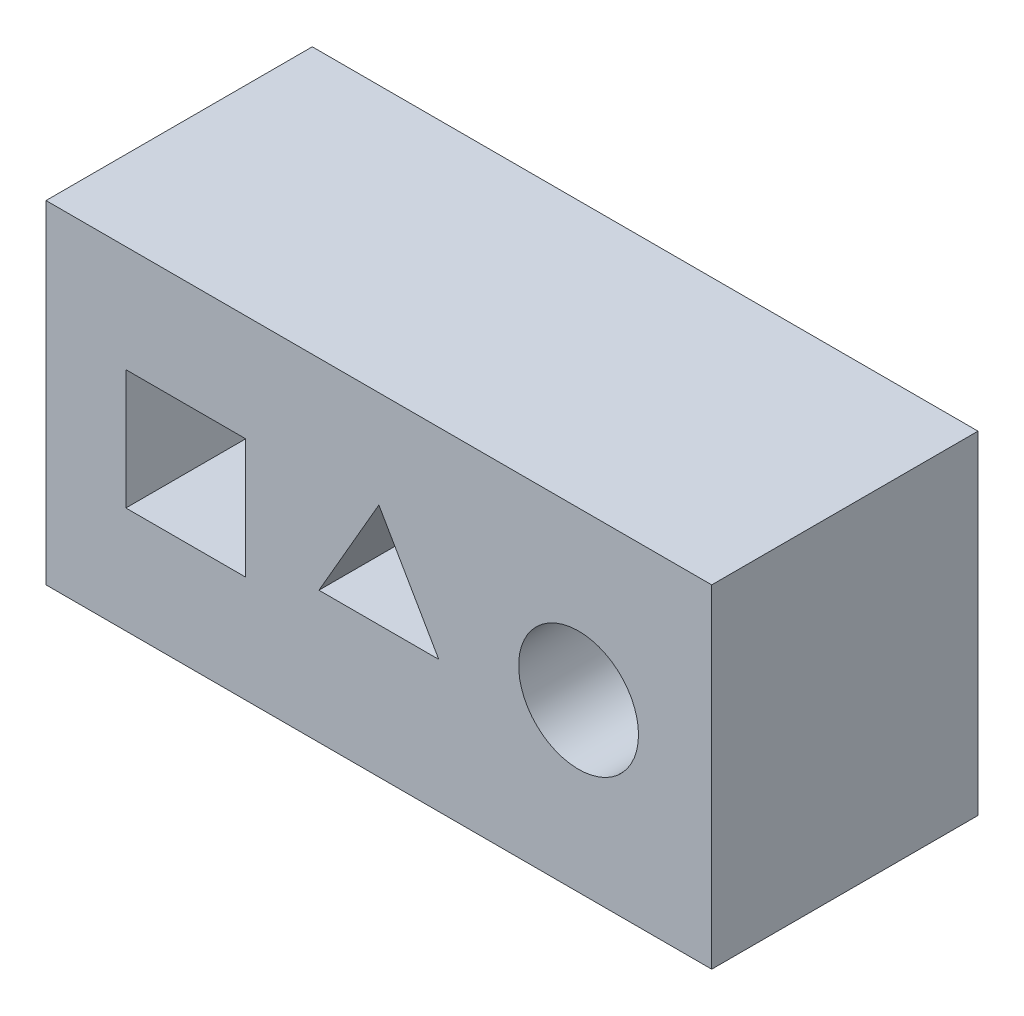
ISO-10303-21;
HEADER;
FILE_DESCRIPTION(('STEP AP214'),'2;1');
FILE_NAME('part.step','',(''),(''),'','','');
FILE_SCHEMA(('AUTOMOTIVE_DESIGN { 1 0 10303 214 1 1 1 1 }'));
ENDSEC;
DATA;
#1=APPLICATION_CONTEXT('core data for automotive mechanical design processes');
#2=APPLICATION_PROTOCOL_DEFINITION('international standard','automotive_design',2000,#1);
#3=PRODUCT_CONTEXT('',#1,'mechanical');
#4=PRODUCT('Part','Part','',(#3));
#5=PRODUCT_RELATED_PRODUCT_CATEGORY('part','',(#4));
#6=PRODUCT_DEFINITION_FORMATION('','',#4);
#7=PRODUCT_DEFINITION_CONTEXT('part definition',#1,'design');
#8=PRODUCT_DEFINITION('design','',#6,#7);
#9=PRODUCT_DEFINITION_SHAPE('','',#8);
#10=(LENGTH_UNIT() NAMED_UNIT(*) SI_UNIT(.MILLI.,.METRE.));
#11=(NAMED_UNIT(*) PLANE_ANGLE_UNIT() SI_UNIT($,.RADIAN.));
#12=(NAMED_UNIT(*) SI_UNIT($,.STERADIAN.) SOLID_ANGLE_UNIT());
#13=UNCERTAINTY_MEASURE_WITH_UNIT(LENGTH_MEASURE(1.E-05),#10,'distance_accuracy_value','');
#14=(GEOMETRIC_REPRESENTATION_CONTEXT(3) GLOBAL_UNCERTAINTY_ASSIGNED_CONTEXT((#13)) GLOBAL_UNIT_ASSIGNED_CONTEXT((#10,
#11,#12)) REPRESENTATION_CONTEXT('',''));
#15=CARTESIAN_POINT('',(0.,0.,0.));
#16=DIRECTION('',(0.,0.,1.));
#17=DIRECTION('',(1.,0.,0.));
#18=AXIS2_PLACEMENT_3D('',#15,#16,#17);
#19=CARTESIAN_POINT('',(0.,0.,100.));
#20=DIRECTION('',(0.,0.,1.));
#21=DIRECTION('',(1.,0.,0.));
#22=AXIS2_PLACEMENT_3D('',#19,#20,#21);
#23=PLANE('',#22);
#24=DIRECTION('',(0.,-1.,0.));
#25=VECTOR('',#24,1.);
#26=CARTESIAN_POINT('',(-125.,-62.5,100.));
#27=LINE('',#26,#25);
#28=CARTESIAN_POINT('',(-125.,62.5,100.));
#29=VERTEX_POINT('',#28);
#30=CARTESIAN_POINT('',(-125.,-62.5,100.));
#31=VERTEX_POINT('',#30);
#32=EDGE_CURVE('E204',#29,#31,#27,.T.);
#33=ORIENTED_EDGE('',*,*,#32,.T.);
#34=DIRECTION('',(1.,0.,0.));
#35=VECTOR('',#34,1.);
#36=CARTESIAN_POINT('',(125.,-62.5,100.));
#37=LINE('',#36,#35);
#38=CARTESIAN_POINT('',(125.,-62.5,100.));
#39=VERTEX_POINT('',#38);
#40=EDGE_CURVE('E92',#31,#39,#37,.T.);
#41=ORIENTED_EDGE('',*,*,#40,.T.);
#42=DIRECTION('',(0.,1.,0.));
#43=VECTOR('',#42,1.);
#44=CARTESIAN_POINT('',(125.,-62.5,100.));
#45=LINE('',#44,#43);
#46=CARTESIAN_POINT('',(125.,62.5,100.));
#47=VERTEX_POINT('',#46);
#48=EDGE_CURVE('E209',#39,#47,#45,.T.);
#49=ORIENTED_EDGE('',*,*,#48,.T.);
#50=DIRECTION('',(-1.,0.,0.));
#51=VECTOR('',#50,1.);
#52=CARTESIAN_POINT('',(125.,62.5,100.));
#53=LINE('',#52,#51);
#54=EDGE_CURVE('E61',#47,#29,#53,.T.);
#55=ORIENTED_EDGE('',*,*,#54,.T.);
#56=EDGE_LOOP('',(#33,#41,#49,#55));
#57=FACE_BOUND('',#56,.T.);
#58=CARTESIAN_POINT('',(74.9999999999999,0.,100.));
#59=DIRECTION('',(0.,0.,1.));
#60=DIRECTION('',(1.,0.,0.));
#61=AXIS2_PLACEMENT_3D('',#58,#59,#60);
#62=CIRCLE('',#61,22.5);
#63=CARTESIAN_POINT('',(97.4999999999999,0.,100.));
#64=VERTEX_POINT('',#63);
#65=EDGE_CURVE('E305',#64,#64,#62,.T.);
#66=ORIENTED_EDGE('',*,*,#65,.F.);
#67=EDGE_LOOP('',(#66));
#68=FACE_BOUND('',#67,.T.);
#69=DIRECTION('',(1.,0.,0.));
#70=VECTOR('',#69,1.);
#71=CARTESIAN_POINT('',(0.,22.5,100.));
#72=LINE('',#71,#70);
#73=CARTESIAN_POINT('',(-95.,22.5,100.));
#74=VERTEX_POINT('',#73);
#75=CARTESIAN_POINT('',(-50.,22.5,100.));
#76=VERTEX_POINT('',#75);
#77=EDGE_CURVE('E293',#74,#76,#72,.T.);
#78=ORIENTED_EDGE('',*,*,#77,.T.);
#79=DIRECTION('',(0.,-1.,0.));
#80=VECTOR('',#79,1.);
#81=CARTESIAN_POINT('',(-50.,0.,100.));
#82=LINE('',#81,#80);
#83=CARTESIAN_POINT('',(-50.,-22.5,100.));
#84=VERTEX_POINT('',#83);
#85=EDGE_CURVE('E289',#76,#84,#82,.T.);
#86=ORIENTED_EDGE('',*,*,#85,.T.);
#87=DIRECTION('',(1.,0.,0.));
#88=VECTOR('',#87,1.);
#89=CARTESIAN_POINT('',(0.,-22.5,100.));
#90=LINE('',#89,#88);
#91=CARTESIAN_POINT('',(-95.,-22.5,100.));
#92=VERTEX_POINT('',#91);
#93=EDGE_CURVE('E177',#92,#84,#90,.T.);
#94=ORIENTED_EDGE('',*,*,#93,.F.);
#95=DIRECTION('',(0.,-1.,0.));
#96=VECTOR('',#95,1.);
#97=CARTESIAN_POINT('',(-95.,0.,100.));
#98=LINE('',#97,#96);
#99=EDGE_CURVE('E182',#74,#92,#98,.T.);
#100=ORIENTED_EDGE('',*,*,#99,.F.);
#101=EDGE_LOOP('',(#78,#86,#94,#100));
#102=FACE_BOUND('',#101,.T.);
#103=DIRECTION('',(0.5,-0.866025403784439,0.));
#104=VECTOR('',#103,1.);
#105=CARTESIAN_POINT('',(11.25,6.49519052838329,100.));
#106=LINE('',#105,#104);
#107=CARTESIAN_POINT('',(0.,25.9807621135332,100.));
#108=VERTEX_POINT('',#107);
#109=CARTESIAN_POINT('',(22.5,-12.9903810567666,100.));
#110=VERTEX_POINT('',#109);
#111=EDGE_CURVE('E160',#108,#110,#106,.T.);
#112=ORIENTED_EDGE('',*,*,#111,.T.);
#113=DIRECTION('',(-1.,0.,0.));
#114=VECTOR('',#113,1.);
#115=CARTESIAN_POINT('',(0.,-12.9903810567666,100.));
#116=LINE('',#115,#114);
#117=CARTESIAN_POINT('',(-22.5,-12.9903810567666,100.));
#118=VERTEX_POINT('',#117);
#119=EDGE_CURVE('E284',#110,#118,#116,.T.);
#120=ORIENTED_EDGE('',*,*,#119,.T.);
#121=DIRECTION('',(0.5,0.866025403784439,0.));
#122=VECTOR('',#121,1.);
#123=CARTESIAN_POINT('',(-11.25,6.49519052838329,100.));
#124=LINE('',#123,#122);
#125=EDGE_CURVE('E148',#118,#108,#124,.T.);
#126=ORIENTED_EDGE('',*,*,#125,.T.);
#127=EDGE_LOOP('',(#112,#120,#126));
#128=FACE_BOUND('',#127,.T.);
#129=ADVANCED_FACE('F43',(#57,#68,#102,#128),#23,.T.);
#130=CARTESIAN_POINT('',(0.,0.,0.));
#131=DIRECTION('',(0.,0.,1.));
#132=DIRECTION('',(1.,0.,0.));
#133=AXIS2_PLACEMENT_3D('',#130,#131,#132);
#134=PLANE('',#133);
#135=DIRECTION('',(0.,-1.,0.));
#136=VECTOR('',#135,1.);
#137=CARTESIAN_POINT('',(-125.,-62.5,0.));
#138=LINE('',#137,#136);
#139=CARTESIAN_POINT('',(-125.,62.5,0.));
#140=VERTEX_POINT('',#139);
#141=CARTESIAN_POINT('',(-125.,-62.5,0.));
#142=VERTEX_POINT('',#141);
#143=EDGE_CURVE('E203',#140,#142,#138,.T.);
#144=ORIENTED_EDGE('',*,*,#143,.F.);
#145=DIRECTION('',(-1.,0.,0.));
#146=VECTOR('',#145,1.);
#147=CARTESIAN_POINT('',(125.,62.5,0.));
#148=LINE('',#147,#146);
#149=CARTESIAN_POINT('',(125.,62.5,0.));
#150=VERTEX_POINT('',#149);
#151=EDGE_CURVE('E85',#150,#140,#148,.T.);
#152=ORIENTED_EDGE('',*,*,#151,.F.);
#153=DIRECTION('',(0.,1.,0.));
#154=VECTOR('',#153,1.);
#155=CARTESIAN_POINT('',(125.,-62.5,0.));
#156=LINE('',#155,#154);
#157=CARTESIAN_POINT('',(125.,-62.5,0.));
#158=VERTEX_POINT('',#157);
#159=EDGE_CURVE('E79',#158,#150,#156,.T.);
#160=ORIENTED_EDGE('',*,*,#159,.F.);
#161=DIRECTION('',(1.,0.,0.));
#162=VECTOR('',#161,1.);
#163=CARTESIAN_POINT('',(125.,-62.5,0.));
#164=LINE('',#163,#162);
#165=EDGE_CURVE('E218',#142,#158,#164,.T.);
#166=ORIENTED_EDGE('',*,*,#165,.F.);
#167=EDGE_LOOP('',(#144,#152,#160,#166));
#168=FACE_BOUND('',#167,.T.);
#169=DIRECTION('',(-0.5,0.866025403784439,0.));
#170=VECTOR('',#169,1.);
#171=CARTESIAN_POINT('',(11.25,6.49519052838329,0.));
#172=LINE('',#171,#170);
#173=CARTESIAN_POINT('',(22.5,-12.9903810567666,0.));
#174=VERTEX_POINT('',#173);
#175=CARTESIAN_POINT('',(0.,25.9807621135332,0.));
#176=VERTEX_POINT('',#175);
#177=EDGE_CURVE('E136',#174,#176,#172,.T.);
#178=ORIENTED_EDGE('',*,*,#177,.T.);
#179=DIRECTION('',(-0.5,-0.866025403784439,0.));
#180=VECTOR('',#179,1.);
#181=CARTESIAN_POINT('',(-11.25,6.49519052838329,0.));
#182=LINE('',#181,#180);
#183=CARTESIAN_POINT('',(-22.5,-12.9903810567666,-1.11022302462516E-13));
#184=VERTEX_POINT('',#183);
#185=EDGE_CURVE('E140',#176,#184,#182,.T.);
#186=ORIENTED_EDGE('',*,*,#185,.T.);
#187=DIRECTION('',(1.,0.,0.));
#188=VECTOR('',#187,1.);
#189=CARTESIAN_POINT('',(0.,-12.9903810567666,0.));
#190=LINE('',#189,#188);
#191=EDGE_CURVE('E143',#184,#174,#190,.T.);
#192=ORIENTED_EDGE('',*,*,#191,.T.);
#193=EDGE_LOOP('',(#178,#186,#192));
#194=FACE_BOUND('',#193,.T.);
#195=DIRECTION('',(-1.,0.,0.));
#196=VECTOR('',#195,1.);
#197=CARTESIAN_POINT('',(0.,22.5,0.));
#198=LINE('',#197,#196);
#199=CARTESIAN_POINT('',(-50.,22.5,0.));
#200=VERTEX_POINT('',#199);
#201=CARTESIAN_POINT('',(-95.,22.5,0.));
#202=VERTEX_POINT('',#201);
#203=EDGE_CURVE('E191',#200,#202,#198,.T.);
#204=ORIENTED_EDGE('',*,*,#203,.T.);
#205=DIRECTION('',(0.,1.,0.));
#206=VECTOR('',#205,1.);
#207=CARTESIAN_POINT('',(-95.,0.,0.));
#208=LINE('',#207,#206);
#209=CARTESIAN_POINT('',(-95.,-22.5,0.));
#210=VERTEX_POINT('',#209);
#211=EDGE_CURVE('E168',#210,#202,#208,.T.);
#212=ORIENTED_EDGE('',*,*,#211,.F.);
#213=DIRECTION('',(-1.,0.,0.));
#214=VECTOR('',#213,1.);
#215=CARTESIAN_POINT('',(0.,-22.5,0.));
#216=LINE('',#215,#214);
#217=CARTESIAN_POINT('',(-50.,-22.5,-1.11022302462516E-13));
#218=VERTEX_POINT('',#217);
#219=EDGE_CURVE('E186',#218,#210,#216,.T.);
#220=ORIENTED_EDGE('',*,*,#219,.F.);
#221=DIRECTION('',(0.,1.,0.));
#222=VECTOR('',#221,1.);
#223=CARTESIAN_POINT('',(-50.,0.,0.));
#224=LINE('',#223,#222);
#225=EDGE_CURVE('E194',#218,#200,#224,.T.);
#226=ORIENTED_EDGE('',*,*,#225,.T.);
#227=EDGE_LOOP('',(#204,#212,#220,#226));
#228=FACE_BOUND('',#227,.T.);
#229=CARTESIAN_POINT('',(74.9999999999999,0.,0.));
#230=DIRECTION('',(0.,0.,1.));
#231=DIRECTION('',(1.,0.,0.));
#232=AXIS2_PLACEMENT_3D('',#229,#230,#231);
#233=CIRCLE('',#232,22.5);
#234=CARTESIAN_POINT('',(97.4999999999999,0.,0.));
#235=VERTEX_POINT('',#234);
#236=EDGE_CURVE('E173',#235,#235,#233,.F.);
#237=ORIENTED_EDGE('',*,*,#236,.F.);
#238=EDGE_LOOP('',(#237));
#239=FACE_BOUND('',#238,.T.);
#240=ADVANCED_FACE('F138',(#168,#194,#228,#239),#134,.F.);
#241=CARTESIAN_POINT('',(-125.,-62.5,100.));
#242=DIRECTION('',(1.,0.,0.));
#243=DIRECTION('',(0.,0.,-1.));
#244=AXIS2_PLACEMENT_3D('',#241,#242,#243);
#245=PLANE('',#244);
#246=ORIENTED_EDGE('',*,*,#143,.T.);
#247=DIRECTION('',(0.,0.,-1.));
#248=VECTOR('',#247,1.);
#249=CARTESIAN_POINT('',(-125.,-62.5,100.));
#250=LINE('',#249,#248);
#251=EDGE_CURVE('E11',#31,#142,#250,.T.);
#252=ORIENTED_EDGE('',*,*,#251,.F.);
#253=ORIENTED_EDGE('',*,*,#32,.F.);
#254=DIRECTION('',(0.,0.,-1.));
#255=VECTOR('',#254,1.);
#256=CARTESIAN_POINT('',(-125.,62.5,100.));
#257=LINE('',#256,#255);
#258=EDGE_CURVE('E214',#29,#140,#257,.T.);
#259=ORIENTED_EDGE('',*,*,#258,.T.);
#260=EDGE_LOOP('',(#246,#252,#253,#259));
#261=FACE_BOUND('',#260,.T.);
#262=ADVANCED_FACE('F45',(#261),#245,.F.);
#263=CARTESIAN_POINT('',(125.,-62.5,100.));
#264=DIRECTION('',(0.,1.,0.));
#265=DIRECTION('',(-1.,0.,0.));
#266=AXIS2_PLACEMENT_3D('',#263,#264,#265);
#267=PLANE('',#266);
#268=ORIENTED_EDGE('',*,*,#165,.T.);
#269=DIRECTION('',(0.,0.,-1.));
#270=VECTOR('',#269,1.);
#271=CARTESIAN_POINT('',(125.,-62.5,100.));
#272=LINE('',#271,#270);
#273=EDGE_CURVE('E53',#39,#158,#272,.T.);
#274=ORIENTED_EDGE('',*,*,#273,.F.);
#275=ORIENTED_EDGE('',*,*,#40,.F.);
#276=ORIENTED_EDGE('',*,*,#251,.T.);
#277=EDGE_LOOP('',(#268,#274,#275,#276));
#278=FACE_BOUND('',#277,.T.);
#279=ADVANCED_FACE('F245',(#278),#267,.F.);
#280=CARTESIAN_POINT('',(125.,-62.5,100.));
#281=DIRECTION('',(-1.,0.,0.));
#282=DIRECTION('',(0.,0.,1.));
#283=AXIS2_PLACEMENT_3D('',#280,#281,#282);
#284=PLANE('',#283);
#285=ORIENTED_EDGE('',*,*,#159,.T.);
#286=DIRECTION('',(0.,0.,-1.));
#287=VECTOR('',#286,1.);
#288=CARTESIAN_POINT('',(125.,62.5,100.));
#289=LINE('',#288,#287);
#290=EDGE_CURVE('E227',#47,#150,#289,.T.);
#291=ORIENTED_EDGE('',*,*,#290,.F.);
#292=ORIENTED_EDGE('',*,*,#48,.F.);
#293=ORIENTED_EDGE('',*,*,#273,.T.);
#294=EDGE_LOOP('',(#285,#291,#292,#293));
#295=FACE_BOUND('',#294,.T.);
#296=ADVANCED_FACE('F231',(#295),#284,.F.);
#297=CARTESIAN_POINT('',(125.,62.5,100.));
#298=DIRECTION('',(0.,-1.,0.));
#299=DIRECTION('',(1.,0.,0.));
#300=AXIS2_PLACEMENT_3D('',#297,#298,#299);
#301=PLANE('',#300);
#302=ORIENTED_EDGE('',*,*,#151,.T.);
#303=ORIENTED_EDGE('',*,*,#258,.F.);
#304=ORIENTED_EDGE('',*,*,#54,.F.);
#305=ORIENTED_EDGE('',*,*,#290,.T.);
#306=EDGE_LOOP('',(#302,#303,#304,#305));
#307=FACE_BOUND('',#306,.T.);
#308=ADVANCED_FACE('F237',(#307),#301,.F.);
#309=CARTESIAN_POINT('',(11.25,6.49519052838329,-279.508497187474));
#310=DIRECTION('',(-0.866025403784439,-0.5,0.));
#311=DIRECTION('',(0.5,-0.866025403784439,0.));
#312=AXIS2_PLACEMENT_3D('',#309,#310,#311);
#313=PLANE('',#312);
#314=ORIENTED_EDGE('',*,*,#177,.F.);
#315=DIRECTION('',(0.,0.,1.));
#316=VECTOR('',#315,1.);
#317=CARTESIAN_POINT('',(22.5,-12.9903810567666,-279.508497187474));
#318=LINE('',#317,#316);
#319=EDGE_CURVE('E164',#174,#110,#318,.T.);
#320=ORIENTED_EDGE('',*,*,#319,.T.);
#321=ORIENTED_EDGE('',*,*,#111,.F.);
#322=DIRECTION('',(0.,0.,1.));
#323=VECTOR('',#322,1.);
#324=CARTESIAN_POINT('',(0.,25.9807621135332,-279.508497187474));
#325=LINE('',#324,#323);
#326=EDGE_CURVE('E153',#176,#108,#325,.T.);
#327=ORIENTED_EDGE('',*,*,#326,.F.);
#328=EDGE_LOOP('',(#314,#320,#321,#327));
#329=FACE_BOUND('',#328,.T.);
#330=ADVANCED_FACE('F158',(#329),#313,.T.);
#331=CARTESIAN_POINT('',(-11.25,6.49519052838329,-279.508497187474));
#332=DIRECTION('',(0.866025403784439,-0.5,0.));
#333=DIRECTION('',(0.5,0.866025403784439,0.));
#334=AXIS2_PLACEMENT_3D('',#331,#332,#333);
#335=PLANE('',#334);
#336=ORIENTED_EDGE('',*,*,#185,.F.);
#337=ORIENTED_EDGE('',*,*,#326,.T.);
#338=ORIENTED_EDGE('',*,*,#125,.F.);
#339=DIRECTION('',(0.,0.,1.));
#340=VECTOR('',#339,1.);
#341=CARTESIAN_POINT('',(-22.5,-12.9903810567666,-279.508497187474));
#342=LINE('',#341,#340);
#343=EDGE_CURVE('E155',#184,#118,#342,.T.);
#344=ORIENTED_EDGE('',*,*,#343,.F.);
#345=EDGE_LOOP('',(#336,#337,#338,#344));
#346=FACE_BOUND('',#345,.T.);
#347=ADVANCED_FACE('F151',(#346),#335,.T.);
#348=CARTESIAN_POINT('',(0.,22.5,-279.508497187474));
#349=DIRECTION('',(0.,-1.,0.));
#350=DIRECTION('',(0.,0.,-1.));
#351=AXIS2_PLACEMENT_3D('',#348,#349,#350);
#352=PLANE('',#351);
#353=ORIENTED_EDGE('',*,*,#203,.F.);
#354=DIRECTION('',(0.,0.,1.));
#355=VECTOR('',#354,1.);
#356=CARTESIAN_POINT('',(-50.,22.5,-279.508497187474));
#357=LINE('',#356,#355);
#358=EDGE_CURVE('E163',#200,#76,#357,.T.);
#359=ORIENTED_EDGE('',*,*,#358,.T.);
#360=ORIENTED_EDGE('',*,*,#77,.F.);
#361=DIRECTION('',(0.,0.,1.));
#362=VECTOR('',#361,1.);
#363=CARTESIAN_POINT('',(-95.,22.5,-279.508497187474));
#364=LINE('',#363,#362);
#365=EDGE_CURVE('E179',#202,#74,#364,.T.);
#366=ORIENTED_EDGE('',*,*,#365,.F.);
#367=EDGE_LOOP('',(#353,#359,#360,#366));
#368=FACE_BOUND('',#367,.T.);
#369=ADVANCED_FACE('F260',(#368),#352,.T.);
#370=CARTESIAN_POINT('',(-95.,0.,-279.508497187474));
#371=DIRECTION('',(-1.,0.,0.));
#372=DIRECTION('',(0.,0.,1.));
#373=AXIS2_PLACEMENT_3D('',#370,#371,#372);
#374=PLANE('',#373);
#375=DIRECTION('',(0.,0.,1.));
#376=VECTOR('',#375,1.);
#377=CARTESIAN_POINT('',(-95.,-22.5,-279.508497187474));
#378=LINE('',#377,#376);
#379=EDGE_CURVE('E183',#210,#92,#378,.T.);
#380=ORIENTED_EDGE('',*,*,#379,.F.);
#381=ORIENTED_EDGE('',*,*,#211,.T.);
#382=ORIENTED_EDGE('',*,*,#365,.T.);
#383=ORIENTED_EDGE('',*,*,#99,.T.);
#384=EDGE_LOOP('',(#380,#381,#382,#383));
#385=FACE_BOUND('',#384,.T.);
#386=ADVANCED_FACE('F263',(#385),#374,.F.);
#387=CARTESIAN_POINT('',(0.,-22.5,-279.508497187474));
#388=DIRECTION('',(0.,-1.,0.));
#389=DIRECTION('',(0.,0.,-1.));
#390=AXIS2_PLACEMENT_3D('',#387,#388,#389);
#391=PLANE('',#390);
#392=DIRECTION('',(0.,0.,1.));
#393=VECTOR('',#392,1.);
#394=CARTESIAN_POINT('',(-50.,-22.5,-279.508497187474));
#395=LINE('',#394,#393);
#396=EDGE_CURVE('E176',#218,#84,#395,.T.);
#397=ORIENTED_EDGE('',*,*,#396,.F.);
#398=ORIENTED_EDGE('',*,*,#219,.T.);
#399=ORIENTED_EDGE('',*,*,#379,.T.);
#400=ORIENTED_EDGE('',*,*,#93,.T.);
#401=EDGE_LOOP('',(#397,#398,#399,#400));
#402=FACE_BOUND('',#401,.T.);
#403=ADVANCED_FACE('F267',(#402),#391,.F.);
#404=CARTESIAN_POINT('',(0.,-12.9903810567666,-279.508497187474));
#405=DIRECTION('',(0.,1.,0.));
#406=DIRECTION('',(-1.,0.,0.));
#407=AXIS2_PLACEMENT_3D('',#404,#405,#406);
#408=PLANE('',#407);
#409=ORIENTED_EDGE('',*,*,#191,.F.);
#410=ORIENTED_EDGE('',*,*,#343,.T.);
#411=ORIENTED_EDGE('',*,*,#119,.F.);
#412=ORIENTED_EDGE('',*,*,#319,.F.);
#413=EDGE_LOOP('',(#409,#410,#411,#412));
#414=FACE_BOUND('',#413,.T.);
#415=ADVANCED_FACE('F271',(#414),#408,.T.);
#416=CARTESIAN_POINT('',(-50.,0.,-279.508497187474));
#417=DIRECTION('',(-1.,0.,0.));
#418=DIRECTION('',(0.,0.,1.));
#419=AXIS2_PLACEMENT_3D('',#416,#417,#418);
#420=PLANE('',#419);
#421=ORIENTED_EDGE('',*,*,#225,.F.);
#422=ORIENTED_EDGE('',*,*,#396,.T.);
#423=ORIENTED_EDGE('',*,*,#85,.F.);
#424=ORIENTED_EDGE('',*,*,#358,.F.);
#425=EDGE_LOOP('',(#421,#422,#423,#424));
#426=FACE_BOUND('',#425,.T.);
#427=ADVANCED_FACE('F258',(#426),#420,.T.);
#428=CARTESIAN_POINT('',(74.9999999999999,0.,-279.508497187474));
#429=DIRECTION('',(0.,0.,1.));
#430=DIRECTION('',(1.,0.,0.));
#431=AXIS2_PLACEMENT_3D('',#428,#429,#430);
#432=CYLINDRICAL_SURFACE('',#431,22.5);
#433=CARTESIAN_POINT('',(97.4999999999999,0.,0.));
#434=CARTESIAN_POINT('',(97.4999999999999,0.,1.04166666666661));
#435=CARTESIAN_POINT('',(97.4999999999999,0.,2.08333333333327));
#436=CARTESIAN_POINT('',(97.4999999999999,0.,4.1666666666666));
#437=CARTESIAN_POINT('',(97.4999999999999,0.,5.20833333333326));
#438=CARTESIAN_POINT('',(97.4999999999999,0.,7.2916666666666));
#439=CARTESIAN_POINT('',(97.4999999999999,0.,8.33333333333329));
#440=CARTESIAN_POINT('',(97.4999999999999,0.,10.4166666666666));
#441=CARTESIAN_POINT('',(97.4999999999999,0.,11.4583333333333));
#442=CARTESIAN_POINT('',(97.4999999999999,0.,13.5416666666666));
#443=CARTESIAN_POINT('',(97.4999999999999,0.,14.5833333333333));
#444=CARTESIAN_POINT('',(97.4999999999999,0.,16.6666666666666));
#445=CARTESIAN_POINT('',(97.4999999999999,0.,17.7083333333333));
#446=CARTESIAN_POINT('',(97.4999999999999,0.,19.7916666666667));
#447=CARTESIAN_POINT('',(97.4999999999999,0.,20.8333333333333));
#448=CARTESIAN_POINT('',(97.4999999999999,0.,22.9166666666666));
#449=CARTESIAN_POINT('',(97.4999999999999,0.,23.9583333333333));
#450=CARTESIAN_POINT('',(97.4999999999999,0.,26.0416666666666));
#451=CARTESIAN_POINT('',(97.4999999999999,0.,27.0833333333333));
#452=CARTESIAN_POINT('',(97.4999999999999,0.,29.1666666666666));
#453=CARTESIAN_POINT('',(97.4999999999999,0.,30.2083333333333));
#454=CARTESIAN_POINT('',(97.4999999999999,0.,32.2916666666666));
#455=CARTESIAN_POINT('',(97.4999999999999,0.,33.3333333333333));
#456=CARTESIAN_POINT('',(97.4999999999999,0.,35.4166666666667));
#457=CARTESIAN_POINT('',(97.4999999999999,0.,36.4583333333333));
#458=CARTESIAN_POINT('',(97.4999999999999,0.,38.5416666666666));
#459=CARTESIAN_POINT('',(97.4999999999999,0.,39.5833333333333));
#460=CARTESIAN_POINT('',(97.4999999999999,0.,41.6666666666667));
#461=CARTESIAN_POINT('',(97.4999999999999,0.,42.7083333333333));
#462=CARTESIAN_POINT('',(97.4999999999999,0.,44.7916666666667));
#463=CARTESIAN_POINT('',(97.4999999999999,0.,45.8333333333333));
#464=CARTESIAN_POINT('',(97.4999999999999,0.,47.9166666666667));
#465=CARTESIAN_POINT('',(97.4999999999999,0.,48.9583333333333));
#466=CARTESIAN_POINT('',(97.4999999999999,0.,51.0416666666667));
#467=CARTESIAN_POINT('',(97.4999999999999,0.,52.0833333333333));
#468=CARTESIAN_POINT('',(97.4999999999999,0.,54.1666666666666));
#469=CARTESIAN_POINT('',(97.4999999999999,0.,55.2083333333333));
#470=CARTESIAN_POINT('',(97.4999999999999,0.,57.2916666666667));
#471=CARTESIAN_POINT('',(97.4999999999999,0.,58.3333333333333));
#472=CARTESIAN_POINT('',(97.4999999999999,0.,60.4166666666667));
#473=CARTESIAN_POINT('',(97.4999999999999,0.,61.4583333333333));
#474=CARTESIAN_POINT('',(97.4999999999999,0.,63.5416666666667));
#475=CARTESIAN_POINT('',(97.4999999999999,0.,64.5833333333333));
#476=CARTESIAN_POINT('',(97.4999999999999,0.,66.6666666666667));
#477=CARTESIAN_POINT('',(97.4999999999999,0.,67.7083333333334));
#478=CARTESIAN_POINT('',(97.4999999999999,0.,69.7916666666667));
#479=CARTESIAN_POINT('',(97.4999999999999,0.,70.8333333333334));
#480=CARTESIAN_POINT('',(97.4999999999999,0.,72.9166666666667));
#481=CARTESIAN_POINT('',(97.4999999999999,0.,73.9583333333333));
#482=CARTESIAN_POINT('',(97.4999999999999,0.,76.0416666666667));
#483=CARTESIAN_POINT('',(97.4999999999999,0.,77.0833333333333));
#484=CARTESIAN_POINT('',(97.4999999999999,0.,79.1666666666667));
#485=CARTESIAN_POINT('',(97.4999999999999,0.,80.2083333333333));
#486=CARTESIAN_POINT('',(97.4999999999999,0.,82.2916666666667));
#487=CARTESIAN_POINT('',(97.4999999999999,0.,83.3333333333334));
#488=CARTESIAN_POINT('',(97.4999999999999,0.,85.4166666666667));
#489=CARTESIAN_POINT('',(97.4999999999999,0.,86.4583333333334));
#490=CARTESIAN_POINT('',(97.4999999999999,0.,88.5416666666667));
#491=CARTESIAN_POINT('',(97.4999999999999,0.,89.5833333333333));
#492=CARTESIAN_POINT('',(97.4999999999999,0.,91.6666666666667));
#493=CARTESIAN_POINT('',(97.4999999999999,0.,92.7083333333334));
#494=CARTESIAN_POINT('',(97.4999999999999,0.,94.7916666666667));
#495=CARTESIAN_POINT('',(97.4999999999999,0.,95.8333333333334));
#496=CARTESIAN_POINT('',(97.4999999999999,0.,97.9166666666667));
#497=CARTESIAN_POINT('',(97.4999999999999,0.,98.9583333333334));
#498=CARTESIAN_POINT('',(97.4999999999999,0.,100.));
#499=B_SPLINE_CURVE_WITH_KNOTS('',3,(#433,#434,#435,#436,#437,#438,#439,#440,#441,#442,#443,
#444,#445,#446,#447,#448,#449,#450,#451,#452,#453,#454,#455,#456,#457,#458,#459,#460,#461,#462,
#463,#464,#465,#466,#467,#468,#469,#470,#471,#472,#473,#474,#475,#476,#477,#478,#479,#480,#481,
#482,#483,#484,#485,#486,#487,#488,#489,#490,#491,#492,#493,#494,#495,#496,#497,#498),
.UNSPECIFIED.,.F.,.F.,(4,2,2,2,2,2,2,2,2,2,2,2,2,2,2,2,2,2,2,2,2,2,2,2,2,2,2,2,2,2,2,2,4),(0.,
3.12499999999999,6.24999999999998,9.37500000000002,12.5,15.625,18.75,21.875,25.,28.125,31.25,
34.375,37.5,40.625,43.7500000000001,46.8750000000001,50.,53.125,56.25,59.3750000000001,
62.5000000000001,65.625,68.7500000000001,71.8750000000001,75.0000000000001,78.1250000000001,
81.25,84.3750000000001,87.5000000000001,90.6250000000001,93.7500000000001,96.8750000000001,
100.),.UNSPECIFIED.);
#500=EDGE_CURVE('BSEAM255',#235,#64,#499,.T.);
#501=ORIENTED_EDGE('',*,*,#236,.T.);
#502=ORIENTED_EDGE('',*,*,#65,.T.);
#503=ORIENTED_EDGE('',*,*,#500,.T.);
#504=ORIENTED_EDGE('',*,*,#500,.F.);
#505=EDGE_LOOP('',(#501,#503,#502,#504));
#506=FACE_BOUND('',#505,.T.);
#507=ADVANCED_FACE('F255',(#506),#432,.F.);
#508=CLOSED_SHELL('',(#129,#240,#262,#279,#296,#308,#330,#347,#369,#386,#403,#415,#427,#507));
#509=MANIFOLD_SOLID_BREP('B2',#508);
#510=ADVANCED_BREP_SHAPE_REPRESENTATION('',(#18,#509),#14);
#511=SHAPE_DEFINITION_REPRESENTATION(#9,#510);
ENDSEC;
END-ISO-10303-21;
